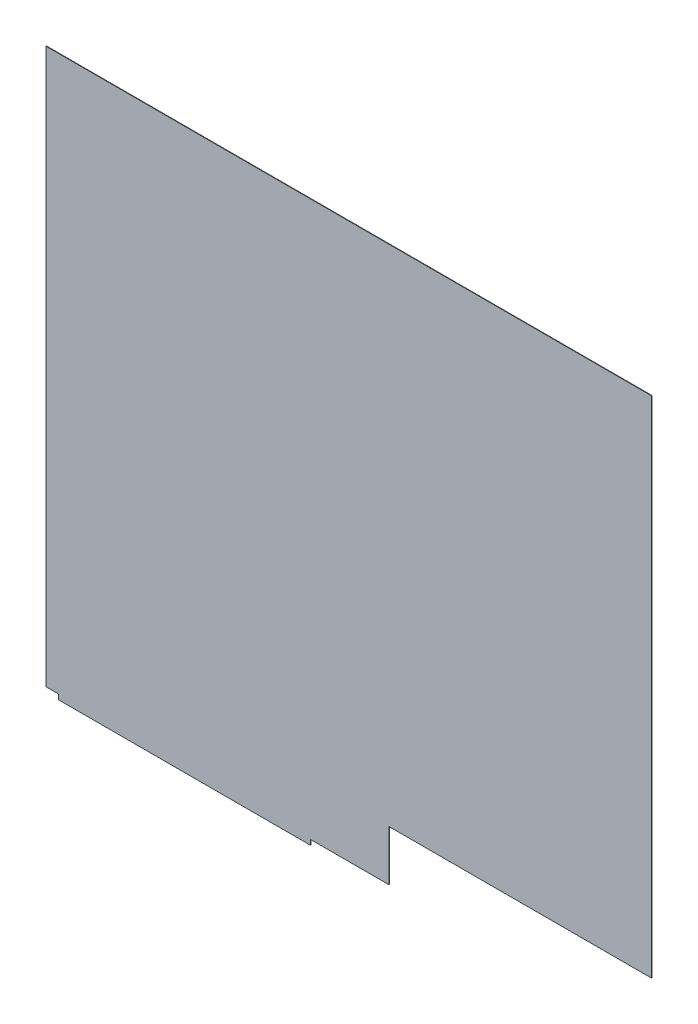
ISO-10303-21;
HEADER;
FILE_DESCRIPTION(('STEP AP214'),'2;1');
FILE_NAME('part.step','',(''),(''),'','','');
FILE_SCHEMA(('AUTOMOTIVE_DESIGN { 1 0 10303 214 1 1 1 1 }'));
ENDSEC;
DATA;
#1=APPLICATION_CONTEXT('core data for automotive mechanical design processes');
#2=APPLICATION_PROTOCOL_DEFINITION('international standard','automotive_design',2000,#1);
#3=PRODUCT_CONTEXT('',#1,'mechanical');
#4=PRODUCT('Part','Part','',(#3));
#5=PRODUCT_RELATED_PRODUCT_CATEGORY('part','',(#4));
#6=PRODUCT_DEFINITION_FORMATION('','',#4);
#7=PRODUCT_DEFINITION_CONTEXT('part definition',#1,'design');
#8=PRODUCT_DEFINITION('design','',#6,#7);
#9=PRODUCT_DEFINITION_SHAPE('','',#8);
#10=(LENGTH_UNIT() NAMED_UNIT(*) SI_UNIT(.MILLI.,.METRE.));
#11=(NAMED_UNIT(*) PLANE_ANGLE_UNIT() SI_UNIT($,.RADIAN.));
#12=(NAMED_UNIT(*) SI_UNIT($,.STERADIAN.) SOLID_ANGLE_UNIT());
#13=UNCERTAINTY_MEASURE_WITH_UNIT(LENGTH_MEASURE(1.E-05),#10,'distance_accuracy_value','');
#14=(GEOMETRIC_REPRESENTATION_CONTEXT(3) GLOBAL_UNCERTAINTY_ASSIGNED_CONTEXT((#13)) GLOBAL_UNIT_ASSIGNED_CONTEXT((#10,
#11,#12)) REPRESENTATION_CONTEXT('',''));
#15=CARTESIAN_POINT('',(0.,0.,0.));
#16=DIRECTION('',(0.,0.,1.));
#17=DIRECTION('',(1.,0.,0.));
#18=AXIS2_PLACEMENT_3D('',#15,#16,#17);
#19=CARTESIAN_POINT('',(-2950.,-2800.,5.));
#20=DIRECTION('',(1.,0.,0.));
#21=DIRECTION('',(0.,1.,0.));
#22=AXIS2_PLACEMENT_3D('',#19,#20,#21);
#23=PLANE('',#22);
#24=DIRECTION('',(0.,-1.,0.));
#25=VECTOR('',#24,1.);
#26=CARTESIAN_POINT('',(-2950.,-2800.,0.));
#27=LINE('',#26,#25);
#28=CARTESIAN_POINT('',(-2950.,2700.,0.));
#29=VERTEX_POINT('',#28);
#30=CARTESIAN_POINT('',(-2950.,-2800.,0.));
#31=VERTEX_POINT('',#30);
#32=EDGE_CURVE('E141',#29,#31,#27,.T.);
#33=ORIENTED_EDGE('',*,*,#32,.T.);
#34=DIRECTION('',(0.,0.,-1.));
#35=VECTOR('',#34,1.);
#36=CARTESIAN_POINT('',(-2950.,-2800.,5.));
#37=LINE('',#36,#35);
#38=CARTESIAN_POINT('',(-2950.,-2800.,5.));
#39=VERTEX_POINT('',#38);
#40=EDGE_CURVE('E11',#39,#31,#37,.T.);
#41=ORIENTED_EDGE('',*,*,#40,.F.);
#42=DIRECTION('',(0.,-1.,0.));
#43=VECTOR('',#42,1.);
#44=CARTESIAN_POINT('',(-2950.,-2800.,5.));
#45=LINE('',#44,#43);
#46=CARTESIAN_POINT('',(-2950.,2700.,5.));
#47=VERTEX_POINT('',#46);
#48=EDGE_CURVE('E159',#47,#39,#45,.T.);
#49=ORIENTED_EDGE('',*,*,#48,.F.);
#50=DIRECTION('',(0.,0.,-1.));
#51=VECTOR('',#50,1.);
#52=CARTESIAN_POINT('',(-2950.,2700.,5.));
#53=LINE('',#52,#51);
#54=EDGE_CURVE('E137',#47,#29,#53,.T.);
#55=ORIENTED_EDGE('',*,*,#54,.T.);
#56=EDGE_LOOP('',(#33,#41,#49,#55));
#57=FACE_BOUND('',#56,.T.);
#58=ADVANCED_FACE('F33',(#57),#23,.F.);
#59=CARTESIAN_POINT('',(-2830.,-2800.,5.));
#60=DIRECTION('',(0.,1.,0.));
#61=DIRECTION('',(0.,0.,1.));
#62=AXIS2_PLACEMENT_3D('',#59,#60,#61);
#63=PLANE('',#62);
#64=DIRECTION('',(1.,0.,0.));
#65=VECTOR('',#64,1.);
#66=CARTESIAN_POINT('',(-2830.,-2800.,0.));
#67=LINE('',#66,#65);
#68=CARTESIAN_POINT('',(-2830.,-2800.,0.));
#69=VERTEX_POINT('',#68);
#70=EDGE_CURVE('E144',#31,#69,#67,.T.);
#71=ORIENTED_EDGE('',*,*,#70,.T.);
#72=DIRECTION('',(0.,0.,-1.));
#73=VECTOR('',#72,1.);
#74=CARTESIAN_POINT('',(-2830.,-2800.,5.));
#75=LINE('',#74,#73);
#76=CARTESIAN_POINT('',(-2830.,-2800.,5.));
#77=VERTEX_POINT('',#76);
#78=EDGE_CURVE('E41',#77,#69,#75,.T.);
#79=ORIENTED_EDGE('',*,*,#78,.F.);
#80=DIRECTION('',(1.,0.,0.));
#81=VECTOR('',#80,1.);
#82=CARTESIAN_POINT('',(-2830.,-2800.,5.));
#83=LINE('',#82,#81);
#84=EDGE_CURVE('E98',#39,#77,#83,.T.);
#85=ORIENTED_EDGE('',*,*,#84,.F.);
#86=ORIENTED_EDGE('',*,*,#40,.T.);
#87=EDGE_LOOP('',(#71,#79,#85,#86));
#88=FACE_BOUND('',#87,.T.);
#89=ADVANCED_FACE('F208',(#88),#63,.F.);
#90=CARTESIAN_POINT('',(-2830.,-2800.,5.));
#91=DIRECTION('',(1.,0.,0.));
#92=DIRECTION('',(0.,0.,-1.));
#93=AXIS2_PLACEMENT_3D('',#90,#91,#92);
#94=PLANE('',#93);
#95=DIRECTION('',(0.,-1.,0.));
#96=VECTOR('',#95,1.);
#97=CARTESIAN_POINT('',(-2830.,-2800.,0.));
#98=LINE('',#97,#96);
#99=CARTESIAN_POINT('',(-2830.,-2850.,0.));
#100=VERTEX_POINT('',#99);
#101=EDGE_CURVE('E146',#69,#100,#98,.T.);
#102=ORIENTED_EDGE('',*,*,#101,.T.);
#103=DIRECTION('',(0.,0.,-1.));
#104=VECTOR('',#103,1.);
#105=CARTESIAN_POINT('',(-2830.,-2850.,5.));
#106=LINE('',#105,#104);
#107=CARTESIAN_POINT('',(-2830.,-2850.,5.));
#108=VERTEX_POINT('',#107);
#109=EDGE_CURVE('E172',#108,#100,#106,.T.);
#110=ORIENTED_EDGE('',*,*,#109,.F.);
#111=DIRECTION('',(0.,-1.,0.));
#112=VECTOR('',#111,1.);
#113=CARTESIAN_POINT('',(-2830.,-2800.,5.));
#114=LINE('',#113,#112);
#115=EDGE_CURVE('E180',#77,#108,#114,.T.);
#116=ORIENTED_EDGE('',*,*,#115,.F.);
#117=ORIENTED_EDGE('',*,*,#78,.T.);
#118=EDGE_LOOP('',(#102,#110,#116,#117));
#119=FACE_BOUND('',#118,.T.);
#120=ADVANCED_FACE('F178',(#119),#94,.F.);
#121=CARTESIAN_POINT('',(-2830.,-2850.,5.));
#122=DIRECTION('',(0.,1.,0.));
#123=DIRECTION('',(0.,0.,1.));
#124=AXIS2_PLACEMENT_3D('',#121,#122,#123);
#125=PLANE('',#124);
#126=DIRECTION('',(1.,0.,0.));
#127=VECTOR('',#126,1.);
#128=CARTESIAN_POINT('',(-2830.,-2850.,0.));
#129=LINE('',#128,#127);
#130=CARTESIAN_POINT('',(-329.999999999998,-2850.,0.));
#131=VERTEX_POINT('',#130);
#132=EDGE_CURVE('E148',#100,#131,#129,.T.);
#133=ORIENTED_EDGE('',*,*,#132,.T.);
#134=DIRECTION('',(0.,0.,-1.));
#135=VECTOR('',#134,1.);
#136=CARTESIAN_POINT('',(-329.999999999998,-2850.,5.));
#137=LINE('',#136,#135);
#138=CARTESIAN_POINT('',(-329.999999999998,-2850.,5.));
#139=VERTEX_POINT('',#138);
#140=EDGE_CURVE('E169',#139,#131,#137,.T.);
#141=ORIENTED_EDGE('',*,*,#140,.F.);
#142=DIRECTION('',(1.,0.,0.));
#143=VECTOR('',#142,1.);
#144=CARTESIAN_POINT('',(-2830.,-2850.,5.));
#145=LINE('',#144,#143);
#146=EDGE_CURVE('E198',#108,#139,#145,.T.);
#147=ORIENTED_EDGE('',*,*,#146,.F.);
#148=ORIENTED_EDGE('',*,*,#109,.T.);
#149=EDGE_LOOP('',(#133,#141,#147,#148));
#150=FACE_BOUND('',#149,.T.);
#151=ADVANCED_FACE('F189',(#150),#125,.F.);
#152=CARTESIAN_POINT('',(-329.999999999998,-2800.,5.));
#153=DIRECTION('',(-1.,0.,0.));
#154=DIRECTION('',(0.,0.,1.));
#155=AXIS2_PLACEMENT_3D('',#152,#153,#154);
#156=PLANE('',#155);
#157=DIRECTION('',(0.,1.,0.));
#158=VECTOR('',#157,1.);
#159=CARTESIAN_POINT('',(-329.999999999998,-2800.,0.));
#160=LINE('',#159,#158);
#161=CARTESIAN_POINT('',(-329.999999999998,-2800.,0.));
#162=VERTEX_POINT('',#161);
#163=EDGE_CURVE('E150',#131,#162,#160,.T.);
#164=ORIENTED_EDGE('',*,*,#163,.T.);
#165=DIRECTION('',(0.,0.,-1.));
#166=VECTOR('',#165,1.);
#167=CARTESIAN_POINT('',(-329.999999999998,-2800.,5.));
#168=LINE('',#167,#166);
#169=CARTESIAN_POINT('',(-329.999999999998,-2800.,5.));
#170=VERTEX_POINT('',#169);
#171=EDGE_CURVE('E166',#170,#162,#168,.T.);
#172=ORIENTED_EDGE('',*,*,#171,.F.);
#173=DIRECTION('',(0.,1.,0.));
#174=VECTOR('',#173,1.);
#175=CARTESIAN_POINT('',(-329.999999999998,-2800.,5.));
#176=LINE('',#175,#174);
#177=EDGE_CURVE('E195',#139,#170,#176,.T.);
#178=ORIENTED_EDGE('',*,*,#177,.F.);
#179=ORIENTED_EDGE('',*,*,#140,.T.);
#180=EDGE_LOOP('',(#164,#172,#178,#179));
#181=FACE_BOUND('',#180,.T.);
#182=ADVANCED_FACE('F193',(#181),#156,.F.);
#183=CARTESIAN_POINT('',(450.000000000002,-2800.,5.));
#184=DIRECTION('',(0.,1.,0.));
#185=DIRECTION('',(-1.,0.,0.));
#186=AXIS2_PLACEMENT_3D('',#183,#184,#185);
#187=PLANE('',#186);
#188=DIRECTION('',(1.,0.,0.));
#189=VECTOR('',#188,1.);
#190=CARTESIAN_POINT('',(450.000000000002,-2800.,0.));
#191=LINE('',#190,#189);
#192=CARTESIAN_POINT('',(450.000000000002,-2800.,0.));
#193=VERTEX_POINT('',#192);
#194=EDGE_CURVE('E152',#162,#193,#191,.T.);
#195=ORIENTED_EDGE('',*,*,#194,.T.);
#196=DIRECTION('',(0.,0.,-1.));
#197=VECTOR('',#196,1.);
#198=CARTESIAN_POINT('',(450.000000000002,-2800.,5.));
#199=LINE('',#198,#197);
#200=CARTESIAN_POINT('',(450.000000000002,-2800.,5.));
#201=VERTEX_POINT('',#200);
#202=EDGE_CURVE('E163',#201,#193,#199,.T.);
#203=ORIENTED_EDGE('',*,*,#202,.F.);
#204=DIRECTION('',(1.,0.,0.));
#205=VECTOR('',#204,1.);
#206=CARTESIAN_POINT('',(450.000000000002,-2800.,5.));
#207=LINE('',#206,#205);
#208=EDGE_CURVE('E197',#170,#201,#207,.T.);
#209=ORIENTED_EDGE('',*,*,#208,.F.);
#210=ORIENTED_EDGE('',*,*,#171,.T.);
#211=EDGE_LOOP('',(#195,#203,#209,#210));
#212=FACE_BOUND('',#211,.T.);
#213=ADVANCED_FACE('F220',(#212),#187,.F.);
#214=CARTESIAN_POINT('',(450.000000000002,-2300.,5.));
#215=DIRECTION('',(-1.,0.,0.));
#216=DIRECTION('',(0.,-1.,0.));
#217=AXIS2_PLACEMENT_3D('',#214,#215,#216);
#218=PLANE('',#217);
#219=DIRECTION('',(0.,1.,0.));
#220=VECTOR('',#219,1.);
#221=CARTESIAN_POINT('',(450.000000000002,-2300.,0.));
#222=LINE('',#221,#220);
#223=CARTESIAN_POINT('',(450.000000000002,-2300.,0.));
#224=VERTEX_POINT('',#223);
#225=EDGE_CURVE('E154',#193,#224,#222,.T.);
#226=ORIENTED_EDGE('',*,*,#225,.T.);
#227=DIRECTION('',(0.,0.,-1.));
#228=VECTOR('',#227,1.);
#229=CARTESIAN_POINT('',(450.000000000002,-2300.,5.));
#230=LINE('',#229,#228);
#231=CARTESIAN_POINT('',(450.000000000002,-2300.,5.));
#232=VERTEX_POINT('',#231);
#233=EDGE_CURVE('E132',#232,#224,#230,.T.);
#234=ORIENTED_EDGE('',*,*,#233,.F.);
#235=DIRECTION('',(0.,1.,0.));
#236=VECTOR('',#235,1.);
#237=CARTESIAN_POINT('',(450.000000000002,-2300.,5.));
#238=LINE('',#237,#236);
#239=EDGE_CURVE('E123',#201,#232,#238,.T.);
#240=ORIENTED_EDGE('',*,*,#239,.F.);
#241=ORIENTED_EDGE('',*,*,#202,.T.);
#242=EDGE_LOOP('',(#226,#234,#240,#241));
#243=FACE_BOUND('',#242,.T.);
#244=ADVANCED_FACE('F223',(#243),#218,.F.);
#245=CARTESIAN_POINT('',(3050.,-2300.,5.));
#246=DIRECTION('',(0.,1.,0.));
#247=DIRECTION('',(-1.,0.,0.));
#248=AXIS2_PLACEMENT_3D('',#245,#246,#247);
#249=PLANE('',#248);
#250=DIRECTION('',(1.,0.,0.));
#251=VECTOR('',#250,1.);
#252=CARTESIAN_POINT('',(3050.,-2300.,0.));
#253=LINE('',#252,#251);
#254=CARTESIAN_POINT('',(3050.,-2300.,0.));
#255=VERTEX_POINT('',#254);
#256=EDGE_CURVE('E131',#224,#255,#253,.T.);
#257=ORIENTED_EDGE('',*,*,#256,.T.);
#258=DIRECTION('',(0.,0.,-1.));
#259=VECTOR('',#258,1.);
#260=CARTESIAN_POINT('',(3050.,-2300.,5.));
#261=LINE('',#260,#259);
#262=CARTESIAN_POINT('',(3050.,-2300.,5.));
#263=VERTEX_POINT('',#262);
#264=EDGE_CURVE('E128',#263,#255,#261,.T.);
#265=ORIENTED_EDGE('',*,*,#264,.F.);
#266=DIRECTION('',(1.,0.,0.));
#267=VECTOR('',#266,1.);
#268=CARTESIAN_POINT('',(3050.,-2300.,5.));
#269=LINE('',#268,#267);
#270=EDGE_CURVE('E117',#232,#263,#269,.T.);
#271=ORIENTED_EDGE('',*,*,#270,.F.);
#272=ORIENTED_EDGE('',*,*,#233,.T.);
#273=EDGE_LOOP('',(#257,#265,#271,#272));
#274=FACE_BOUND('',#273,.T.);
#275=ADVANCED_FACE('F129',(#274),#249,.F.);
#276=CARTESIAN_POINT('',(3050.,-2300.,5.));
#277=DIRECTION('',(-1.,0.,0.));
#278=DIRECTION('',(0.,-1.,0.));
#279=AXIS2_PLACEMENT_3D('',#276,#277,#278);
#280=PLANE('',#279);
#281=DIRECTION('',(0.,1.,0.));
#282=VECTOR('',#281,1.);
#283=CARTESIAN_POINT('',(3050.,-2300.,0.));
#284=LINE('',#283,#282);
#285=CARTESIAN_POINT('',(3050.,2700.,0.));
#286=VERTEX_POINT('',#285);
#287=EDGE_CURVE('E84',#255,#286,#284,.T.);
#288=ORIENTED_EDGE('',*,*,#287,.T.);
#289=DIRECTION('',(0.,0.,-1.));
#290=VECTOR('',#289,1.);
#291=CARTESIAN_POINT('',(3050.,2700.,5.));
#292=LINE('',#291,#290);
#293=CARTESIAN_POINT('',(3050.,2700.,5.));
#294=VERTEX_POINT('',#293);
#295=EDGE_CURVE('E133',#294,#286,#292,.T.);
#296=ORIENTED_EDGE('',*,*,#295,.F.);
#297=DIRECTION('',(0.,1.,0.));
#298=VECTOR('',#297,1.);
#299=CARTESIAN_POINT('',(3050.,-2300.,5.));
#300=LINE('',#299,#298);
#301=EDGE_CURVE('E121',#263,#294,#300,.T.);
#302=ORIENTED_EDGE('',*,*,#301,.F.);
#303=ORIENTED_EDGE('',*,*,#264,.T.);
#304=EDGE_LOOP('',(#288,#296,#302,#303));
#305=FACE_BOUND('',#304,.T.);
#306=ADVANCED_FACE('F135',(#305),#280,.F.);
#307=CARTESIAN_POINT('',(3050.,2700.,5.));
#308=DIRECTION('',(0.,-1.,0.));
#309=DIRECTION('',(1.,0.,0.));
#310=AXIS2_PLACEMENT_3D('',#307,#308,#309);
#311=PLANE('',#310);
#312=DIRECTION('',(-1.,0.,0.));
#313=VECTOR('',#312,1.);
#314=CARTESIAN_POINT('',(3050.,2700.,0.));
#315=LINE('',#314,#313);
#316=EDGE_CURVE('E90',#286,#29,#315,.T.);
#317=ORIENTED_EDGE('',*,*,#316,.T.);
#318=ORIENTED_EDGE('',*,*,#54,.F.);
#319=DIRECTION('',(-1.,0.,0.));
#320=VECTOR('',#319,1.);
#321=CARTESIAN_POINT('',(3050.,2700.,5.));
#322=LINE('',#321,#320);
#323=EDGE_CURVE('E49',#294,#47,#322,.T.);
#324=ORIENTED_EDGE('',*,*,#323,.F.);
#325=ORIENTED_EDGE('',*,*,#295,.T.);
#326=EDGE_LOOP('',(#317,#318,#324,#325));
#327=FACE_BOUND('',#326,.T.);
#328=ADVANCED_FACE('F232',(#327),#311,.F.);
#329=CARTESIAN_POINT('',(0.,0.,5.));
#330=DIRECTION('',(0.,0.,1.));
#331=DIRECTION('',(1.,0.,0.));
#332=AXIS2_PLACEMENT_3D('',#329,#330,#331);
#333=PLANE('',#332);
#334=ORIENTED_EDGE('',*,*,#48,.T.);
#335=ORIENTED_EDGE('',*,*,#84,.T.);
#336=ORIENTED_EDGE('',*,*,#115,.T.);
#337=ORIENTED_EDGE('',*,*,#146,.T.);
#338=ORIENTED_EDGE('',*,*,#177,.T.);
#339=ORIENTED_EDGE('',*,*,#208,.T.);
#340=ORIENTED_EDGE('',*,*,#239,.T.);
#341=ORIENTED_EDGE('',*,*,#270,.T.);
#342=ORIENTED_EDGE('',*,*,#301,.T.);
#343=ORIENTED_EDGE('',*,*,#323,.T.);
#344=EDGE_LOOP('',(#334,#335,#336,#337,#338,#339,#340,#341,#342,#343));
#345=FACE_BOUND('',#344,.T.);
#346=ADVANCED_FACE('F119',(#345),#333,.T.);
#347=CARTESIAN_POINT('',(0.,0.,0.));
#348=DIRECTION('',(0.,0.,1.));
#349=DIRECTION('',(1.,0.,0.));
#350=AXIS2_PLACEMENT_3D('',#347,#348,#349);
#351=PLANE('',#350);
#352=ORIENTED_EDGE('',*,*,#32,.F.);
#353=ORIENTED_EDGE('',*,*,#316,.F.);
#354=ORIENTED_EDGE('',*,*,#287,.F.);
#355=ORIENTED_EDGE('',*,*,#256,.F.);
#356=ORIENTED_EDGE('',*,*,#225,.F.);
#357=ORIENTED_EDGE('',*,*,#194,.F.);
#358=ORIENTED_EDGE('',*,*,#163,.F.);
#359=ORIENTED_EDGE('',*,*,#132,.F.);
#360=ORIENTED_EDGE('',*,*,#101,.F.);
#361=ORIENTED_EDGE('',*,*,#70,.F.);
#362=EDGE_LOOP('',(#352,#353,#354,#355,#356,#357,#358,#359,#360,#361));
#363=FACE_BOUND('',#362,.T.);
#364=ADVANCED_FACE('F184',(#363),#351,.F.);
#365=CLOSED_SHELL('',(#58,#89,#120,#151,#182,#213,#244,#275,#306,#328,#346,#364));
#366=MANIFOLD_SOLID_BREP('B2',#365);
#367=ADVANCED_BREP_SHAPE_REPRESENTATION('',(#18,#366),#14);
#368=SHAPE_DEFINITION_REPRESENTATION(#9,#367);
ENDSEC;
END-ISO-10303-21;
